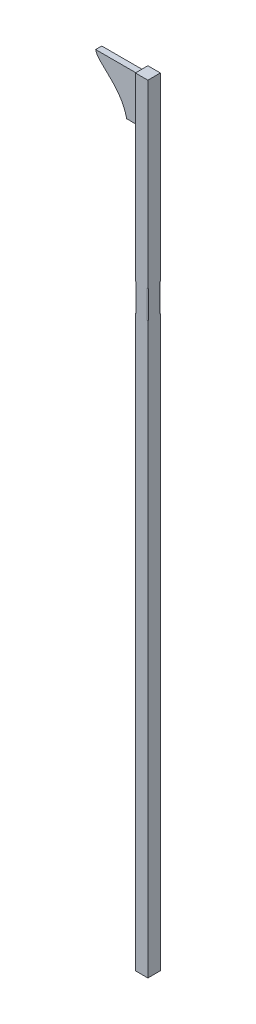
ISO-10303-21;
HEADER;
FILE_DESCRIPTION(('STEP AP214'),'2;1');
FILE_NAME('part.step','',(''),(''),'','','');
FILE_SCHEMA(('AUTOMOTIVE_DESIGN { 1 0 10303 214 1 1 1 1 }'));
ENDSEC;
DATA;
#1=APPLICATION_CONTEXT('core data for automotive mechanical design processes');
#2=APPLICATION_PROTOCOL_DEFINITION('international standard','automotive_design',2000,#1);
#3=PRODUCT_CONTEXT('',#1,'mechanical');
#4=PRODUCT('Part','Part','',(#3));
#5=PRODUCT_RELATED_PRODUCT_CATEGORY('part','',(#4));
#6=PRODUCT_DEFINITION_FORMATION('','',#4);
#7=PRODUCT_DEFINITION_CONTEXT('part definition',#1,'design');
#8=PRODUCT_DEFINITION('design','',#6,#7);
#9=PRODUCT_DEFINITION_SHAPE('','',#8);
#10=(LENGTH_UNIT() NAMED_UNIT(*) SI_UNIT(.MILLI.,.METRE.));
#11=(NAMED_UNIT(*) PLANE_ANGLE_UNIT() SI_UNIT($,.RADIAN.));
#12=(NAMED_UNIT(*) SI_UNIT($,.STERADIAN.) SOLID_ANGLE_UNIT());
#13=UNCERTAINTY_MEASURE_WITH_UNIT(LENGTH_MEASURE(1.E-05),#10,'distance_accuracy_value','');
#14=(GEOMETRIC_REPRESENTATION_CONTEXT(3) GLOBAL_UNCERTAINTY_ASSIGNED_CONTEXT((#13)) GLOBAL_UNIT_ASSIGNED_CONTEXT((#10,
#11,#12)) REPRESENTATION_CONTEXT('',''));
#15=CARTESIAN_POINT('',(0.,0.,0.));
#16=DIRECTION('',(0.,0.,1.));
#17=DIRECTION('',(1.,0.,0.));
#18=AXIS2_PLACEMENT_3D('',#15,#16,#17);
#19=CARTESIAN_POINT('',(0.85,2.9,0.110173502610086));
#20=DIRECTION('',(0.,0.,1.));
#21=DIRECTION('',(1.,0.,0.));
#22=AXIS2_PLACEMENT_3D('',#19,#20,#21);
#23=PLANE('',#22);
#24=DIRECTION('',(0.,1.,0.));
#25=VECTOR('',#24,1.);
#26=CARTESIAN_POINT('',(0.85,2.9,0.110173502610086));
#27=LINE('',#26,#25);
#28=CARTESIAN_POINT('',(0.85,1.3,0.110173502610086));
#29=VERTEX_POINT('',#28);
#30=CARTESIAN_POINT('',(0.85,2.9,0.110173502610086));
#31=VERTEX_POINT('',#30);
#32=EDGE_CURVE('E241',#29,#31,#27,.T.);
#33=ORIENTED_EDGE('',*,*,#32,.T.);
#34=DIRECTION('',(1.,0.,0.));
#35=VECTOR('',#34,1.);
#36=CARTESIAN_POINT('',(0.85,2.9,0.110173502610086));
#37=LINE('',#36,#35);
#38=CARTESIAN_POINT('',(-0.695429372194855,2.9,0.110173502610086));
#39=VERTEX_POINT('',#38);
#40=EDGE_CURVE('E112',#31,#39,#37,.F.);
#41=ORIENTED_EDGE('',*,*,#40,.T.);
#42=CARTESIAN_POINT('',(-0.695429372194855,2.9,0.110173502610086));
#43=CARTESIAN_POINT('',(-0.693743010396967,2.89020941359016,0.110173502610086));
#44=CARTESIAN_POINT('',(-0.691443286062049,2.88055261613905,0.110173502610086));
#45=CARTESIAN_POINT('',(-0.685858469884509,2.86156319851085,0.110173502610086));
#46=CARTESIAN_POINT('',(-0.682577059484016,2.85222951004612,0.110173502610086));
#47=CARTESIAN_POINT('',(-0.671659505621603,2.82485725320819,0.110173502610086));
#48=CARTESIAN_POINT('',(-0.662910976582811,2.80726943969666,0.110173502610086));
#49=CARTESIAN_POINT('',(-0.6439681571841,2.77390892412903,0.110173502610086));
#50=CARTESIAN_POINT('',(-0.633849612469007,2.75809107626599,0.110173502610086));
#51=CARTESIAN_POINT('',(-0.612471710255078,2.72726653572626,0.110173502610086));
#52=CARTESIAN_POINT('',(-0.601212993609684,2.71225939457226,0.110173502610086));
#53=CARTESIAN_POINT('',(-0.583734455628072,2.69023298955676,0.110173502610086));
#54=CARTESIAN_POINT('',(-0.577811392100028,2.68297329495508,0.110173502610086));
#55=CARTESIAN_POINT('',(-0.559788641575943,2.66140176835493,0.110173502610086));
#56=CARTESIAN_POINT('',(-0.54743699205387,2.64729959745781,0.110173502610086));
#57=CARTESIAN_POINT('',(-0.522261676733863,2.61953095438562,0.110173502610086));
#58=CARTESIAN_POINT('',(-0.509438059727299,2.60586443744431,0.110173502610086));
#59=CARTESIAN_POINT('',(-0.483453692230627,2.57885845768262,0.110173502610086));
#60=CARTESIAN_POINT('',(-0.470292961328184,2.56551897594794,0.110173502610086));
#61=CARTESIAN_POINT('',(-0.443737348609213,2.53907719202553,0.110173502610086));
#62=CARTESIAN_POINT('',(-0.430342474522504,2.52597488203695,0.110173502610086));
#63=CARTESIAN_POINT('',(-0.38993087794896,2.48690355706978,0.110173502610086));
#64=CARTESIAN_POINT('',(-0.362687315106192,2.46117028277675,0.110173502610086));
#65=CARTESIAN_POINT('',(-0.321733195940544,2.42266845755311,0.110173502610086));
#66=CARTESIAN_POINT('',(-0.308067273625455,2.40985109313162,0.110173502610086));
#67=CARTESIAN_POINT('',(-0.28075066867141,2.38419978294292,0.110173502610086));
#68=CARTESIAN_POINT('',(-0.267099986039994,2.37136583716751,0.110173502610086));
#69=CARTESIAN_POINT('',(-0.239857654340333,2.34563560302649,0.110173502610086));
#70=CARTESIAN_POINT('',(-0.226266005463026,2.33273931445951,0.110173502610086));
#71=CARTESIAN_POINT('',(-0.185637928007136,2.29389243101258,0.110173502610086));
#72=CARTESIAN_POINT('',(-0.158749514946432,2.26778488126992,0.110173502610086));
#73=CARTESIAN_POINT('',(-0.11894487321419,2.22809538503721,0.110173502610086));
#74=CARTESIAN_POINT('',(-0.105764788914697,2.21477766452826,0.110173502610086));
#75=CARTESIAN_POINT('',(-0.066539549213783,2.17450676537068,0.110173502610086));
#76=CARTESIAN_POINT('',(-0.0408129107125575,2.14723922429029,0.110173502610086));
#77=CARTESIAN_POINT('',(-0.00309705002108546,2.10555067899688,0.110173502610086));
#78=CARTESIAN_POINT('',(0.00932864456145964,2.09152398460811,0.110173502610086));
#79=CARTESIAN_POINT('',(0.033851507948452,2.06318650579164,0.110173502610086));
#80=CARTESIAN_POINT('',(0.0459486725289555,2.04887571771542,0.110173502610086));
#81=CARTESIAN_POINT('',(0.0816991335272794,2.00547647270423,0.110173502610086));
#82=CARTESIAN_POINT('',(0.104804238961328,1.97592897647773,0.110173502610086));
#83=CARTESIAN_POINT('',(0.138140870484324,1.93065072473418,0.110173502610086));
#84=CARTESIAN_POINT('',(0.149031649688048,1.91540041035821,0.110173502610086));
#85=CARTESIAN_POINT('',(0.181012735542857,1.86914597057402,0.110173502610086));
#86=CARTESIAN_POINT('',(0.20140305620887,1.8376494701496,0.110173502610086));
#87=CARTESIAN_POINT('',(0.230412078802925,1.7894739741318,0.110173502610086));
#88=CARTESIAN_POINT('',(0.239817495727318,1.77326328128982,0.110173502610086));
#89=CARTESIAN_POINT('',(0.258086310316687,1.74053930654597,0.110173502610086));
#90=CARTESIAN_POINT('',(0.266949705249493,1.72402602311937,0.110173502610086));
#91=CARTESIAN_POINT('',(0.292708708413838,1.67403265228314,0.110173502610086));
#92=CARTESIAN_POINT('',(0.308764765338648,1.64011291064353,0.110173502610086));
#93=CARTESIAN_POINT('',(0.331089752645885,1.58849462478003,0.110173502610086));
#94=CARTESIAN_POINT('',(0.338236892465258,1.57116919872642,0.110173502610086));
#95=CARTESIAN_POINT('',(0.351944467962792,1.53628726926922,0.110173502610086));
#96=CARTESIAN_POINT('',(0.358504904718552,1.51873076629014,0.110173502610086));
#97=CARTESIAN_POINT('',(0.376413517801572,1.46824986377578,0.110173502610086));
#98=CARTESIAN_POINT('',(0.387038900833349,1.43506682141457,0.110173502610086));
#99=CARTESIAN_POINT('',(0.406306850163346,1.36799652628218,0.110173502610086));
#100=CARTESIAN_POINT('',(0.41494194229057,1.33410712392479,0.110173502610086));
#101=CARTESIAN_POINT('',(0.422568765411088,1.3,0.110173502610086));
#102=B_SPLINE_CURVE_WITH_KNOTS('',3,(#42,#43,#44,#45,#46,#47,#48,#49,#50,#51,#52,#53,#54,#55,
#56,#57,#58,#59,#60,#61,#62,#63,#64,#65,#66,#67,#68,#69,#70,#71,#72,#73,#74,#75,#76,#77,#78,#79,
#80,#81,#82,#83,#84,#85,#86,#87,#88,#89,#90,#91,#92,#93,#94,#95,#96,#97,#98,#99,#100,#101),
.UNSPECIFIED.,.F.,.F.,(4,2,2,2,2,2,2,2,2,2,2,2,2,2,2,2,2,2,2,2,2,2,2,2,2,2,2,2,2,4),(0.,
0.0297436220414956,0.0593770710499198,0.118105170148429,0.174377705293055,0.230618785202047,
0.258725530106993,0.314946936817664,0.371162547670008,0.427374899546846,0.483585399164937,
0.596006970226482,0.652215734151485,0.708424525874238,0.764633499263295,0.877056135730666,
0.933266293735685,1.04570119976743,1.10191325032018,1.1581260232552,1.2705833906442,
1.32679822701093,1.43927026239768,1.49548652826316,1.55170307747461,1.66418467139521,
1.72040144538854,1.7766181161261,1.88107838963386,1.98592477533249),.UNSPECIFIED.);
#103=CARTESIAN_POINT('',(0.422568765411088,1.3,0.110173502610086));
#104=VERTEX_POINT('',#103);
#105=EDGE_CURVE('E24',#39,#104,#102,.T.);
#106=ORIENTED_EDGE('',*,*,#105,.T.);
#107=DIRECTION('',(1.,0.,0.));
#108=VECTOR('',#107,1.);
#109=CARTESIAN_POINT('',(0.85,1.3,0.110173502610086));
#110=LINE('',#109,#108);
#111=EDGE_CURVE('E244',#104,#29,#110,.T.);
#112=ORIENTED_EDGE('',*,*,#111,.T.);
#113=EDGE_LOOP('',(#33,#41,#106,#112));
#114=FACE_BOUND('',#113,.T.);
#115=ADVANCED_FACE('F17',(#114),#23,.T.);
#116=CARTESIAN_POINT('',(-0.695429372194855,2.9,0.110173502610086));
#117=CARTESIAN_POINT('',(-0.695429372194855,2.9,-0.258517350261009));
#118=CARTESIAN_POINT('',(-0.693387265277208,2.88809636380361,0.110173502610086));
#119=CARTESIAN_POINT('',(-0.693387265277208,2.88809636380361,-0.258517350261009));
#120=CARTESIAN_POINT('',(-0.687600545375743,2.86371605209398,0.110173502610086));
#121=CARTESIAN_POINT('',(-0.687600545375743,2.86371605209398,-0.258517350261009));
#122=CARTESIAN_POINT('',(-0.673812765073498,2.82542645863569,0.110173502610086));
#123=CARTESIAN_POINT('',(-0.673812765073498,2.82542645863569,-0.258517350261009));
#124=CARTESIAN_POINT('',(-0.645140964065163,2.77091049315777,0.110173502610086));
#125=CARTESIAN_POINT('',(-0.645140964065163,2.77091049315777,-0.258517350261009));
#126=CARTESIAN_POINT('',(-0.59198445007733,2.69682923305623,0.110173502610086));
#127=CARTESIAN_POINT('',(-0.59198445007733,2.69682923305623,-0.258517350261009));
#128=CARTESIAN_POINT('',(-0.521823108463555,2.61658428599538,0.110173502610086));
#129=CARTESIAN_POINT('',(-0.521823108463555,2.61658428599538,-0.258517350261009));
#130=CARTESIAN_POINT('',(-0.435874126069901,2.52992903397786,0.110173502610086));
#131=CARTESIAN_POINT('',(-0.435874126069901,2.52992903397786,-0.258517350261009));
#132=CARTESIAN_POINT('',(-0.33697744399691,2.43667637262445,0.110173502610086));
#133=CARTESIAN_POINT('',(-0.33697744399691,2.43667637262445,-0.258517350261009));
#134=CARTESIAN_POINT('',(-0.229552972077057,2.33672192162866,0.110173502610086));
#135=CARTESIAN_POINT('',(-0.229552972077057,2.33672192162866,-0.258517350261009));
#136=CARTESIAN_POINT('',(-0.118750676248019,2.23000623278704,0.110173502610086));
#137=CARTESIAN_POINT('',(-0.118750676248019,2.23000623278704,-0.258517350261009));
#138=CARTESIAN_POINT('',(-0.00984904519551834,2.1165180277452,0.110173502610086));
#139=CARTESIAN_POINT('',(-0.00984904519551834,2.1165180277452,-0.258517350261009));
#140=CARTESIAN_POINT('',(0.0923766508681799,1.99630033573052,0.110173502610086));
#141=CARTESIAN_POINT('',(0.0923766508681799,1.99630033573052,-0.258517350261009));
#142=CARTESIAN_POINT('',(0.184391492529208,1.8694934666017,0.110173502610086));
#143=CARTESIAN_POINT('',(0.184391492529208,1.8694934666017,-0.258517350261009));
#144=CARTESIAN_POINT('',(0.26429618325359,1.73634817183317,0.110173502610086));
#145=CARTESIAN_POINT('',(0.26429618325359,1.73634817183317,-0.258517350261009));
#146=CARTESIAN_POINT('',(0.33122746908363,1.59713590790976,0.110173502610086));
#147=CARTESIAN_POINT('',(0.33122746908363,1.59713590790976,-0.258517350261009));
#148=CARTESIAN_POINT('',(0.374255321752616,1.48110565683171,0.110173502610086));
#149=CARTESIAN_POINT('',(0.374255321752616,1.48110565683171,-0.258517350261009));
#150=CARTESIAN_POINT('',(0.40067200183349,1.39153608835763,0.110173502610086));
#151=CARTESIAN_POINT('',(0.40067200183349,1.39153608835763,-0.258517350261009));
#152=CARTESIAN_POINT('',(0.415700322073785,1.33069931887451,0.110173502610086));
#153=CARTESIAN_POINT('',(0.415700322073785,1.33069931887451,-0.258517350261009));
#154=CARTESIAN_POINT('',(0.422568765411088,1.3,0.110173502610086));
#155=CARTESIAN_POINT('',(0.422568765411088,1.3,-0.258517350261009));
#156=B_SPLINE_SURFACE_WITH_KNOTS('',5,1,((#116,#117),(#118,#119),(#120,#121),(#122,#123),(#124,
#125),(#126,#127),(#128,#129),(#130,#131),(#132,#133),(#134,#135),(#136,#137),(#138,#139),(#140,
#141),(#142,#143),(#144,#145),(#146,#147),(#148,#149),(#150,#151),(#152,#153),(#154,#155)),
.UNSPECIFIED.,.F.,.F.,.F.,(6,1,1,1,1,1,1,1,1,1,1,1,1,1,1,6),(2,2),(0.,0.0666666666666667,
0.133333333333333,0.2,0.266666666666667,0.333333333333333,0.4,0.466666666666667,
0.533333333333333,0.6,0.666666666666667,0.733333333333333,0.8,0.866666666666667,
0.933333333333333,1.),(0.,0.0368690852871095),.UNSPECIFIED.);
#157=DIRECTION('',(0.,0.,-1.));
#158=VECTOR('',#157,1.);
#159=CARTESIAN_POINT('',(0.422568765411088,1.3,0.));
#160=LINE('',#159,#158);
#161=CARTESIAN_POINT('',(0.422568765411088,1.3,-0.110173502610086));
#162=VERTEX_POINT('',#161);
#163=EDGE_CURVE('E211',#104,#162,#160,.T.);
#164=DIRECTION('',(0.,0.,1.));
#165=VECTOR('',#164,1.);
#166=CARTESIAN_POINT('',(-0.695429372194855,2.9,0.));
#167=LINE('',#166,#165);
#168=CARTESIAN_POINT('',(-0.695429372194855,2.9,-0.110173502610086));
#169=VERTEX_POINT('',#168);
#170=EDGE_CURVE('E228',#169,#39,#167,.T.);
#171=CARTESIAN_POINT('',(0.422568765411088,1.3,-0.110173502610086));
#172=CARTESIAN_POINT('',(0.412154632224265,1.34662072203885,-0.110173502610086));
#173=CARTESIAN_POINT('',(0.399841752934884,1.39282962290545,-0.110173502610086));
#174=CARTESIAN_POINT('',(0.371405565912336,1.48405901261098,-0.110173502610086));
#175=CARTESIAN_POINT('',(0.355282177280435,1.52907947619632,-0.110173502610086));
#176=CARTESIAN_POINT('',(0.319466262267442,1.61694262679933,-0.110173502610086));
#177=CARTESIAN_POINT('',(0.299827153422635,1.65980704445106,-0.110173502610086));
#178=CARTESIAN_POINT('',(0.256994284469701,1.74370620538035,-0.110173502610086));
#179=CARTESIAN_POINT('',(0.233801373552192,1.78474138274381,-0.110173502610086));
#180=CARTESIAN_POINT('',(0.186755591604197,1.86063573520738,-0.110173502610086));
#181=CARTESIAN_POINT('',(0.163221407114944,1.8956937232152,-0.110173502610086));
#182=CARTESIAN_POINT('',(0.113872842840117,1.96416842562567,-0.110173502610086));
#183=CARTESIAN_POINT('',(0.0880580592860444,1.99758484776128,-0.110173502610086));
#184=CARTESIAN_POINT('',(0.0344809400541347,2.06294904788528,-0.110173502610086));
#185=CARTESIAN_POINT('',(0.00671380585450841,2.09489286342842,-0.110173502610086));
#186=CARTESIAN_POINT('',(-0.0502636269461311,2.15745366930699,-0.110173502610086));
#187=CARTESIAN_POINT('',(-0.0794738612511874,2.18807071864133,-0.110173502610086));
#188=CARTESIAN_POINT('',(-0.161719592694615,2.27141537018441,-0.110173502610086));
#189=CARTESIAN_POINT('',(-0.215828605492879,2.32307066701699,-0.110173502610086));
#190=CARTESIAN_POINT('',(-0.297506216631087,2.3999791666338,-0.110173502610086));
#191=CARTESIAN_POINT('',(-0.324819651438351,2.42552131656231,-0.110173502610086));
#192=CARTESIAN_POINT('',(-0.37924104305594,2.47682363607506,-0.110173502610086));
#193=CARTESIAN_POINT('',(-0.406349024821064,2.50258377835012,-0.110173502610086));
#194=CARTESIAN_POINT('',(-0.44814534248856,2.5434189014607,-0.110173502610086));
#195=CARTESIAN_POINT('',(-0.463080525136,2.55823996987489,-0.110173502610086));
#196=CARTESIAN_POINT('',(-0.49259405841964,2.58824028595205,-0.110173502610086));
#197=CARTESIAN_POINT('',(-0.507172349239848,2.60341959283067,-0.110173502610086));
#198=CARTESIAN_POINT('',(-0.535836331868208,2.63431448912963,-0.110173502610086));
#199=CARTESIAN_POINT('',(-0.549920626832662,2.65003138435749,-0.110173502610086));
#200=CARTESIAN_POINT('',(-0.57730384671812,2.6821313915072,-0.110173502610086));
#201=CARTESIAN_POINT('',(-0.590603108466261,2.69851421253577,-0.110173502610086));
#202=CARTESIAN_POINT('',(-0.618197740105102,2.73499876718826,-0.110173502610086));
#203=CARTESIAN_POINT('',(-0.632282744082727,2.75526167461861,-0.110173502610086));
#204=CARTESIAN_POINT('',(-0.657790542110257,2.79728789702035,-0.110173502610086));
#205=CARTESIAN_POINT('',(-0.669233177396491,2.81903832587496,-0.110173502610086));
#206=CARTESIAN_POINT('',(-0.682165127781988,2.85109905650452,-0.110173502610086));
#207=CARTESIAN_POINT('',(-0.685553899516295,2.86062871176227,-0.110173502610086));
#208=CARTESIAN_POINT('',(-0.691325086403159,2.88005677827577,-0.110173502610086));
#209=CARTESIAN_POINT('',(-0.693700257321053,2.88995731138347,-0.110173502610086));
#210=CARTESIAN_POINT('',(-0.695429372194855,2.9,-0.110173502610086));
#211=B_SPLINE_CURVE_WITH_KNOTS('',3,(#171,#172,#173,#174,#175,#176,#177,#178,#179,#180,#181,
#182,#183,#184,#185,#186,#187,#188,#189,#190,#191,#192,#193,#194,#195,#196,#197,#198,#199,#200,
#201,#202,#203,#204,#205,#206,#207,#208,#209,#210),.UNSPECIFIED.,.F.,.F.,(4,2,2,2,2,2,2,2,2,2,2,
2,2,2,2,2,2,2,2,4),(0.,0.143288606457201,0.286580255265811,0.427855509072659,0.569097057268753,
0.695670199914399,0.822265796774349,0.949184221086102,1.07609699575846,1.30045096140533,
1.41264326560923,1.52482171696632,1.58794085447353,1.65107049947255,1.71436622774738,
1.77763459788071,1.8515748284723,1.92494035530808,1.955232628086,1.98573791508355),.UNSPECIFIED.);
#212=EDGE_CURVE('E214',#162,#169,#211,.T.);
#213=ORIENTED_EDGE('',*,*,#163,.F.);
#214=ORIENTED_EDGE('',*,*,#105,.F.);
#215=ORIENTED_EDGE('',*,*,#170,.F.);
#216=ORIENTED_EDGE('',*,*,#212,.F.);
#217=EDGE_LOOP('',(#213,#214,#215,#216));
#218=FACE_BOUND('',#217,.T.);
#219=ADVANCED_FACE('F19',(#218),#156,.F.);
#220=CARTESIAN_POINT('',(0.,2.9,0.));
#221=DIRECTION('',(0.,1.,0.));
#222=DIRECTION('',(0.,0.,1.));
#223=AXIS2_PLACEMENT_3D('',#220,#221,#222);
#224=PLANE('',#223);
#225=DIRECTION('',(0.,0.,1.));
#226=VECTOR('',#225,1.);
#227=CARTESIAN_POINT('',(0.85,2.9,0.));
#228=LINE('',#227,#226);
#229=CARTESIAN_POINT('',(0.85,2.9,-0.110173502610086));
#230=VERTEX_POINT('',#229);
#231=EDGE_CURVE('E230',#31,#230,#228,.F.);
#232=ORIENTED_EDGE('',*,*,#231,.T.);
#233=DIRECTION('',(-1.,0.,0.));
#234=VECTOR('',#233,1.);
#235=CARTESIAN_POINT('',(-0.85,2.9,-0.110173502610086));
#236=LINE('',#235,#234);
#237=EDGE_CURVE('E268',#169,#230,#236,.F.);
#238=ORIENTED_EDGE('',*,*,#237,.F.);
#239=ORIENTED_EDGE('',*,*,#170,.T.);
#240=ORIENTED_EDGE('',*,*,#40,.F.);
#241=EDGE_LOOP('',(#232,#238,#239,#240));
#242=FACE_BOUND('',#241,.T.);
#243=ADVANCED_FACE('F306',(#242),#224,.T.);
#244=CARTESIAN_POINT('',(0.,-3.5,0.));
#245=DIRECTION('',(0.,-1.,0.));
#246=DIRECTION('',(0.,0.,-1.));
#247=AXIS2_PLACEMENT_3D('',#244,#245,#246);
#248=PLANE('',#247);
#249=DIRECTION('',(0.,0.,-1.));
#250=VECTOR('',#249,1.);
#251=CARTESIAN_POINT('',(1.3,-3.5,0.225));
#252=LINE('',#251,#250);
#253=CARTESIAN_POINT('',(1.3,-3.5,0.225));
#254=VERTEX_POINT('',#253);
#255=CARTESIAN_POINT('',(1.3,-3.5,0.2));
#256=VERTEX_POINT('',#255);
#257=EDGE_CURVE('E189',#254,#256,#252,.T.);
#258=ORIENTED_EDGE('',*,*,#257,.F.);
#259=DIRECTION('',(1.,0.,0.));
#260=VECTOR('',#259,1.);
#261=CARTESIAN_POINT('',(0.85,-3.5,0.225));
#262=LINE('',#261,#260);
#263=CARTESIAN_POINT('',(1.275,-3.5,0.225));
#264=VERTEX_POINT('',#263);
#265=EDGE_CURVE('E174',#264,#254,#262,.T.);
#266=ORIENTED_EDGE('',*,*,#265,.F.);
#267=CARTESIAN_POINT('',(1.275,-3.5,0.2));
#268=DIRECTION('',(0.,1.,0.));
#269=DIRECTION('',(0.,0.,1.));
#270=AXIS2_PLACEMENT_3D('',#267,#268,#269);
#271=CIRCLE('',#270,0.025);
#272=EDGE_CURVE('E191',#256,#264,#271,.F.);
#273=ORIENTED_EDGE('',*,*,#272,.F.);
#274=EDGE_LOOP('',(#258,#266,#273));
#275=FACE_BOUND('',#274,.T.);
#276=ADVANCED_FACE('F190',(#275),#248,.T.);
#277=CARTESIAN_POINT('',(1.275,0.,0.2));
#278=DIRECTION('',(0.,1.,0.));
#279=DIRECTION('',(0.,0.,1.));
#280=AXIS2_PLACEMENT_3D('',#277,#278,#279);
#281=CYLINDRICAL_SURFACE('',#280,0.025);
#282=CARTESIAN_POINT('',(1.275,-4.5,0.2));
#283=DIRECTION('',(0.,1.,0.));
#284=DIRECTION('',(0.,0.,1.));
#285=AXIS2_PLACEMENT_3D('',#282,#283,#284);
#286=CIRCLE('',#285,0.025);
#287=CARTESIAN_POINT('',(1.275,-4.5,0.225));
#288=VERTEX_POINT('',#287);
#289=CARTESIAN_POINT('',(1.3,-4.5,0.2));
#290=VERTEX_POINT('',#289);
#291=EDGE_CURVE('E186',#288,#290,#286,.T.);
#292=ORIENTED_EDGE('',*,*,#291,.T.);
#293=DIRECTION('',(0.,1.,0.));
#294=VECTOR('',#293,1.);
#295=CARTESIAN_POINT('',(1.3,0.,0.2));
#296=LINE('',#295,#294);
#297=EDGE_CURVE('E195',#256,#290,#296,.F.);
#298=ORIENTED_EDGE('',*,*,#297,.F.);
#299=ORIENTED_EDGE('',*,*,#272,.T.);
#300=DIRECTION('',(0.,1.,0.));
#301=VECTOR('',#300,1.);
#302=CARTESIAN_POINT('',(1.275,0.,0.225));
#303=LINE('',#302,#301);
#304=EDGE_CURVE('E182',#288,#264,#303,.T.);
#305=ORIENTED_EDGE('',*,*,#304,.F.);
#306=EDGE_LOOP('',(#292,#298,#299,#305));
#307=FACE_BOUND('',#306,.T.);
#308=ADVANCED_FACE('F299',(#307),#281,.T.);
#309=CARTESIAN_POINT('',(0.,-4.5,0.));
#310=DIRECTION('',(0.,-1.,0.));
#311=DIRECTION('',(0.,0.,-1.));
#312=AXIS2_PLACEMENT_3D('',#309,#310,#311);
#313=PLANE('',#312);
#314=DIRECTION('',(1.,0.,0.));
#315=VECTOR('',#314,1.);
#316=CARTESIAN_POINT('',(0.85,-4.5,0.225));
#317=LINE('',#316,#315);
#318=CARTESIAN_POINT('',(1.3,-4.5,0.225));
#319=VERTEX_POINT('',#318);
#320=EDGE_CURVE('E239',#319,#288,#317,.F.);
#321=ORIENTED_EDGE('',*,*,#320,.F.);
#322=DIRECTION('',(0.,0.,-1.));
#323=VECTOR('',#322,1.);
#324=CARTESIAN_POINT('',(1.3,-4.5,0.225));
#325=LINE('',#324,#323);
#326=EDGE_CURVE('E442',#290,#319,#325,.F.);
#327=ORIENTED_EDGE('',*,*,#326,.F.);
#328=ORIENTED_EDGE('',*,*,#291,.F.);
#329=EDGE_LOOP('',(#321,#327,#328));
#330=FACE_BOUND('',#329,.T.);
#331=ADVANCED_FACE('F295',(#330),#313,.F.);
#332=CARTESIAN_POINT('',(0.,-3.5,0.));
#333=DIRECTION('',(0.,-1.,0.));
#334=DIRECTION('',(0.,0.,-1.));
#335=AXIS2_PLACEMENT_3D('',#332,#333,#334);
#336=PLANE('',#335);
#337=DIRECTION('',(1.,0.,0.));
#338=VECTOR('',#337,1.);
#339=CARTESIAN_POINT('',(0.85,-3.5,0.225));
#340=LINE('',#339,#338);
#341=CARTESIAN_POINT('',(0.85,-3.5,0.225));
#342=VERTEX_POINT('',#341);
#343=CARTESIAN_POINT('',(0.875,-3.5,0.225));
#344=VERTEX_POINT('',#343);
#345=EDGE_CURVE('E185',#342,#344,#340,.T.);
#346=ORIENTED_EDGE('',*,*,#345,.F.);
#347=DIRECTION('',(0.,0.,1.));
#348=VECTOR('',#347,1.);
#349=CARTESIAN_POINT('',(0.85,-3.5,-0.225));
#350=LINE('',#349,#348);
#351=CARTESIAN_POINT('',(0.85,-3.5,0.2));
#352=VERTEX_POINT('',#351);
#353=EDGE_CURVE('E420',#352,#342,#350,.T.);
#354=ORIENTED_EDGE('',*,*,#353,.F.);
#355=CARTESIAN_POINT('',(0.875,-3.5,0.2));
#356=DIRECTION('',(0.,1.,0.));
#357=DIRECTION('',(0.,0.,1.));
#358=AXIS2_PLACEMENT_3D('',#355,#356,#357);
#359=CIRCLE('',#358,0.025);
#360=EDGE_CURVE('E403',#344,#352,#359,.F.);
#361=ORIENTED_EDGE('',*,*,#360,.F.);
#362=EDGE_LOOP('',(#346,#354,#361));
#363=FACE_BOUND('',#362,.T.);
#364=ADVANCED_FACE('F292',(#363),#336,.T.);
#365=CARTESIAN_POINT('',(0.85,0.,0.225));
#366=DIRECTION('',(0.,0.,1.));
#367=DIRECTION('',(1.,0.,0.));
#368=AXIS2_PLACEMENT_3D('',#365,#366,#367);
#369=PLANE('',#368);
#370=ORIENTED_EDGE('',*,*,#320,.T.);
#371=ORIENTED_EDGE('',*,*,#304,.T.);
#372=ORIENTED_EDGE('',*,*,#265,.T.);
#373=DIRECTION('',(0.,1.,0.));
#374=VECTOR('',#373,1.);
#375=CARTESIAN_POINT('',(1.3,0.,0.225));
#376=LINE('',#375,#374);
#377=CARTESIAN_POINT('',(1.3,3.,0.225));
#378=VERTEX_POINT('',#377);
#379=EDGE_CURVE('E179',#378,#254,#376,.F.);
#380=ORIENTED_EDGE('',*,*,#379,.F.);
#381=DIRECTION('',(1.,0.,0.));
#382=VECTOR('',#381,1.);
#383=CARTESIAN_POINT('',(1.075,3.,0.225));
#384=LINE('',#383,#382);
#385=CARTESIAN_POINT('',(0.85,3.,0.225));
#386=VERTEX_POINT('',#385);
#387=EDGE_CURVE('E261',#386,#378,#384,.T.);
#388=ORIENTED_EDGE('',*,*,#387,.F.);
#389=DIRECTION('',(0.,1.,0.));
#390=VECTOR('',#389,1.);
#391=CARTESIAN_POINT('',(0.85,0.,0.225));
#392=LINE('',#391,#390);
#393=EDGE_CURVE('E381',#342,#386,#392,.T.);
#394=ORIENTED_EDGE('',*,*,#393,.F.);
#395=ORIENTED_EDGE('',*,*,#345,.T.);
#396=DIRECTION('',(0.,1.,0.));
#397=VECTOR('',#396,1.);
#398=CARTESIAN_POINT('',(0.875,0.,0.225));
#399=LINE('',#398,#397);
#400=CARTESIAN_POINT('',(0.875,-4.5,0.225));
#401=VERTEX_POINT('',#400);
#402=EDGE_CURVE('E215',#401,#344,#399,.T.);
#403=ORIENTED_EDGE('',*,*,#402,.F.);
#404=DIRECTION('',(1.,0.,0.));
#405=VECTOR('',#404,1.);
#406=CARTESIAN_POINT('',(0.,-4.5,0.225));
#407=LINE('',#406,#405);
#408=CARTESIAN_POINT('',(0.85,-4.5,0.225));
#409=VERTEX_POINT('',#408);
#410=EDGE_CURVE('E238',#401,#409,#407,.F.);
#411=ORIENTED_EDGE('',*,*,#410,.T.);
#412=DIRECTION('',(0.,1.,0.));
#413=VECTOR('',#412,1.);
#414=CARTESIAN_POINT('',(0.85,0.,0.225));
#415=LINE('',#414,#413);
#416=CARTESIAN_POINT('',(0.85,-25.,0.225));
#417=VERTEX_POINT('',#416);
#418=EDGE_CURVE('E411',#417,#409,#415,.T.);
#419=ORIENTED_EDGE('',*,*,#418,.F.);
#420=DIRECTION('',(1.,0.,0.));
#421=VECTOR('',#420,1.);
#422=CARTESIAN_POINT('',(1.075,-25.,0.225));
#423=LINE('',#422,#421);
#424=CARTESIAN_POINT('',(1.3,-25.,0.225));
#425=VERTEX_POINT('',#424);
#426=EDGE_CURVE('E418',#425,#417,#423,.F.);
#427=ORIENTED_EDGE('',*,*,#426,.F.);
#428=DIRECTION('',(0.,1.,0.));
#429=VECTOR('',#428,1.);
#430=CARTESIAN_POINT('',(1.3,0.,0.225));
#431=LINE('',#430,#429);
#432=EDGE_CURVE('E439',#319,#425,#431,.F.);
#433=ORIENTED_EDGE('',*,*,#432,.F.);
#434=EDGE_LOOP('',(#370,#371,#372,#380,#388,#394,#395,#403,#411,#419,#427,#433));
#435=FACE_BOUND('',#434,.T.);
#436=ADVANCED_FACE('F177',(#435),#369,.T.);
#437=CARTESIAN_POINT('',(0.,-4.5,0.));
#438=DIRECTION('',(0.,-1.,0.));
#439=DIRECTION('',(0.,0.,-1.));
#440=AXIS2_PLACEMENT_3D('',#437,#438,#439);
#441=PLANE('',#440);
#442=DIRECTION('',(0.,0.,1.));
#443=VECTOR('',#442,1.);
#444=CARTESIAN_POINT('',(0.85,-4.5,-0.225));
#445=LINE('',#444,#443);
#446=CARTESIAN_POINT('',(0.85,-4.5,0.2));
#447=VERTEX_POINT('',#446);
#448=EDGE_CURVE('E408',#409,#447,#445,.F.);
#449=ORIENTED_EDGE('',*,*,#448,.F.);
#450=ORIENTED_EDGE('',*,*,#410,.F.);
#451=CARTESIAN_POINT('',(0.875,-4.5,0.2));
#452=DIRECTION('',(0.,1.,0.));
#453=DIRECTION('',(0.,0.,1.));
#454=AXIS2_PLACEMENT_3D('',#451,#452,#453);
#455=CIRCLE('',#454,0.025);
#456=EDGE_CURVE('E236',#447,#401,#455,.T.);
#457=ORIENTED_EDGE('',*,*,#456,.F.);
#458=EDGE_LOOP('',(#449,#450,#457));
#459=FACE_BOUND('',#458,.T.);
#460=ADVANCED_FACE('F285',(#459),#441,.F.);
#461=CARTESIAN_POINT('',(0.875,0.,0.2));
#462=DIRECTION('',(0.,1.,0.));
#463=DIRECTION('',(0.,0.,1.));
#464=AXIS2_PLACEMENT_3D('',#461,#462,#463);
#465=CYLINDRICAL_SURFACE('',#464,0.025);
#466=ORIENTED_EDGE('',*,*,#456,.T.);
#467=ORIENTED_EDGE('',*,*,#402,.T.);
#468=ORIENTED_EDGE('',*,*,#360,.T.);
#469=DIRECTION('',(0.,1.,0.));
#470=VECTOR('',#469,1.);
#471=CARTESIAN_POINT('',(0.85,0.,0.2));
#472=LINE('',#471,#470);
#473=EDGE_CURVE('E225',#447,#352,#472,.T.);
#474=ORIENTED_EDGE('',*,*,#473,.F.);
#475=EDGE_LOOP('',(#466,#467,#468,#474));
#476=FACE_BOUND('',#475,.T.);
#477=ADVANCED_FACE('F281',(#476),#465,.T.);
#478=CARTESIAN_POINT('',(0.,1.3,0.));
#479=DIRECTION('',(0.,-1.,0.));
#480=DIRECTION('',(0.,0.,-1.));
#481=AXIS2_PLACEMENT_3D('',#478,#479,#480);
#482=PLANE('',#481);
#483=DIRECTION('',(0.,0.,1.));
#484=VECTOR('',#483,1.);
#485=CARTESIAN_POINT('',(0.85,1.3,-0.225));
#486=LINE('',#485,#484);
#487=CARTESIAN_POINT('',(0.85,1.3,-0.110173502610086));
#488=VERTEX_POINT('',#487);
#489=EDGE_CURVE('E220',#29,#488,#486,.F.);
#490=ORIENTED_EDGE('',*,*,#489,.F.);
#491=ORIENTED_EDGE('',*,*,#111,.F.);
#492=ORIENTED_EDGE('',*,*,#163,.T.);
#493=DIRECTION('',(-1.,0.,0.));
#494=VECTOR('',#493,1.);
#495=CARTESIAN_POINT('',(-0.85,1.3,-0.110173502610086));
#496=LINE('',#495,#494);
#497=EDGE_CURVE('E393',#488,#162,#496,.T.);
#498=ORIENTED_EDGE('',*,*,#497,.F.);
#499=EDGE_LOOP('',(#490,#491,#492,#498));
#500=FACE_BOUND('',#499,.T.);
#501=ADVANCED_FACE('F276',(#500),#482,.T.);
#502=CARTESIAN_POINT('',(-0.85,2.9,-0.110173502610086));
#503=DIRECTION('',(0.,0.,-1.));
#504=DIRECTION('',(-1.,0.,0.));
#505=AXIS2_PLACEMENT_3D('',#502,#503,#504);
#506=PLANE('',#505);
#507=DIRECTION('',(0.,1.,0.));
#508=VECTOR('',#507,1.);
#509=CARTESIAN_POINT('',(0.85,0.,-0.110173502610086));
#510=LINE('',#509,#508);
#511=EDGE_CURVE('E216',#488,#230,#510,.T.);
#512=ORIENTED_EDGE('',*,*,#511,.F.);
#513=ORIENTED_EDGE('',*,*,#497,.T.);
#514=ORIENTED_EDGE('',*,*,#212,.T.);
#515=ORIENTED_EDGE('',*,*,#237,.T.);
#516=EDGE_LOOP('',(#512,#513,#514,#515));
#517=FACE_BOUND('',#516,.T.);
#518=ADVANCED_FACE('F270',(#517),#506,.T.);
#519=CARTESIAN_POINT('',(0.,-3.5,0.));
#520=DIRECTION('',(0.,-1.,0.));
#521=DIRECTION('',(0.,0.,-1.));
#522=AXIS2_PLACEMENT_3D('',#519,#520,#521);
#523=PLANE('',#522);
#524=DIRECTION('',(0.,0.,1.));
#525=VECTOR('',#524,1.);
#526=CARTESIAN_POINT('',(0.85,-3.5,-0.225));
#527=LINE('',#526,#525);
#528=CARTESIAN_POINT('',(0.85,-3.5,-0.225));
#529=VERTEX_POINT('',#528);
#530=CARTESIAN_POINT('',(0.85,-3.5,-0.2));
#531=VERTEX_POINT('',#530);
#532=EDGE_CURVE('E129',#529,#531,#527,.T.);
#533=ORIENTED_EDGE('',*,*,#532,.F.);
#534=DIRECTION('',(-1.,0.,0.));
#535=VECTOR('',#534,1.);
#536=CARTESIAN_POINT('',(1.3,-3.5,-0.225));
#537=LINE('',#536,#535);
#538=CARTESIAN_POINT('',(0.875,-3.5,-0.225));
#539=VERTEX_POINT('',#538);
#540=EDGE_CURVE('E135',#539,#529,#537,.T.);
#541=ORIENTED_EDGE('',*,*,#540,.F.);
#542=CARTESIAN_POINT('',(0.875,-3.5,-0.2));
#543=DIRECTION('',(0.,-1.,0.));
#544=DIRECTION('',(0.,0.,-1.));
#545=AXIS2_PLACEMENT_3D('',#542,#543,#544);
#546=CIRCLE('',#545,0.025);
#547=EDGE_CURVE('E252',#531,#539,#546,.T.);
#548=ORIENTED_EDGE('',*,*,#547,.F.);
#549=EDGE_LOOP('',(#533,#541,#548));
#550=FACE_BOUND('',#549,.T.);
#551=ADVANCED_FACE('F275',(#550),#523,.T.);
#552=CARTESIAN_POINT('',(1.075,3.,0.));
#553=DIRECTION('',(0.,1.,0.));
#554=DIRECTION('',(0.,0.,1.));
#555=AXIS2_PLACEMENT_3D('',#552,#553,#554);
#556=PLANE('',#555);
#557=DIRECTION('',(0.,0.,-1.));
#558=VECTOR('',#557,1.);
#559=CARTESIAN_POINT('',(1.3,3.,0.225));
#560=LINE('',#559,#558);
#561=CARTESIAN_POINT('',(1.3,3.,-0.225));
#562=VERTEX_POINT('',#561);
#563=EDGE_CURVE('E200',#562,#378,#560,.F.);
#564=ORIENTED_EDGE('',*,*,#563,.F.);
#565=DIRECTION('',(-1.,0.,0.));
#566=VECTOR('',#565,1.);
#567=CARTESIAN_POINT('',(1.3,3.,-0.225));
#568=LINE('',#567,#566);
#569=CARTESIAN_POINT('',(0.85,3.,-0.225));
#570=VERTEX_POINT('',#569);
#571=EDGE_CURVE('E360',#570,#562,#568,.F.);
#572=ORIENTED_EDGE('',*,*,#571,.F.);
#573=DIRECTION('',(0.,0.,1.));
#574=VECTOR('',#573,1.);
#575=CARTESIAN_POINT('',(0.85,3.,-0.225));
#576=LINE('',#575,#574);
#577=EDGE_CURVE('E379',#386,#570,#576,.F.);
#578=ORIENTED_EDGE('',*,*,#577,.F.);
#579=ORIENTED_EDGE('',*,*,#387,.T.);
#580=EDGE_LOOP('',(#564,#572,#578,#579));
#581=FACE_BOUND('',#580,.T.);
#582=ADVANCED_FACE('F350',(#581),#556,.T.);
#583=CARTESIAN_POINT('',(0.,-3.5,0.));
#584=DIRECTION('',(0.,-1.,0.));
#585=DIRECTION('',(0.,0.,-1.));
#586=AXIS2_PLACEMENT_3D('',#583,#584,#585);
#587=PLANE('',#586);
#588=DIRECTION('',(-1.,0.,0.));
#589=VECTOR('',#588,1.);
#590=CARTESIAN_POINT('',(1.3,-3.5,-0.225));
#591=LINE('',#590,#589);
#592=CARTESIAN_POINT('',(1.3,-3.5,-0.225));
#593=VERTEX_POINT('',#592);
#594=CARTESIAN_POINT('',(1.275,-3.5,-0.225));
#595=VERTEX_POINT('',#594);
#596=EDGE_CURVE('E367',#593,#595,#591,.T.);
#597=ORIENTED_EDGE('',*,*,#596,.F.);
#598=DIRECTION('',(0.,0.,-1.));
#599=VECTOR('',#598,1.);
#600=CARTESIAN_POINT('',(1.3,-3.5,0.225));
#601=LINE('',#600,#599);
#602=CARTESIAN_POINT('',(1.3,-3.5,-0.2));
#603=VERTEX_POINT('',#602);
#604=EDGE_CURVE('E202',#603,#593,#601,.T.);
#605=ORIENTED_EDGE('',*,*,#604,.F.);
#606=CARTESIAN_POINT('',(1.275,-3.5,-0.2));
#607=DIRECTION('',(0.,1.,0.));
#608=DIRECTION('',(0.,0.,1.));
#609=AXIS2_PLACEMENT_3D('',#606,#607,#608);
#610=CIRCLE('',#609,0.025);
#611=EDGE_CURVE('E258',#595,#603,#610,.F.);
#612=ORIENTED_EDGE('',*,*,#611,.F.);
#613=EDGE_LOOP('',(#597,#605,#612));
#614=FACE_BOUND('',#613,.T.);
#615=ADVANCED_FACE('F347',(#614),#587,.T.);
#616=CARTESIAN_POINT('',(1.275,0.,-0.2));
#617=DIRECTION('',(0.,1.,0.));
#618=DIRECTION('',(0.,0.,1.));
#619=AXIS2_PLACEMENT_3D('',#616,#617,#618);
#620=CYLINDRICAL_SURFACE('',#619,0.025);
#621=CARTESIAN_POINT('',(1.275,-4.5,-0.2));
#622=DIRECTION('',(0.,1.,0.));
#623=DIRECTION('',(0.,0.,1.));
#624=AXIS2_PLACEMENT_3D('',#621,#622,#623);
#625=CIRCLE('',#624,0.025);
#626=CARTESIAN_POINT('',(1.3,-4.5,-0.2));
#627=VERTEX_POINT('',#626);
#628=CARTESIAN_POINT('',(1.275,-4.5,-0.225));
#629=VERTEX_POINT('',#628);
#630=EDGE_CURVE('E256',#627,#629,#625,.T.);
#631=ORIENTED_EDGE('',*,*,#630,.T.);
#632=DIRECTION('',(0.,1.,0.));
#633=VECTOR('',#632,1.);
#634=CARTESIAN_POINT('',(1.275,0.,-0.225));
#635=LINE('',#634,#633);
#636=EDGE_CURVE('E478',#595,#629,#635,.F.);
#637=ORIENTED_EDGE('',*,*,#636,.F.);
#638=ORIENTED_EDGE('',*,*,#611,.T.);
#639=DIRECTION('',(0.,1.,0.));
#640=VECTOR('',#639,1.);
#641=CARTESIAN_POINT('',(1.3,0.,-0.2));
#642=LINE('',#641,#640);
#643=EDGE_CURVE('E445',#627,#603,#642,.T.);
#644=ORIENTED_EDGE('',*,*,#643,.F.);
#645=EDGE_LOOP('',(#631,#637,#638,#644));
#646=FACE_BOUND('',#645,.T.);
#647=ADVANCED_FACE('F343',(#646),#620,.T.);
#648=CARTESIAN_POINT('',(0.,-4.5,0.));
#649=DIRECTION('',(0.,-1.,0.));
#650=DIRECTION('',(0.,0.,-1.));
#651=AXIS2_PLACEMENT_3D('',#648,#649,#650);
#652=PLANE('',#651);
#653=DIRECTION('',(0.,0.,-1.));
#654=VECTOR('',#653,1.);
#655=CARTESIAN_POINT('',(1.3,-4.5,0.225));
#656=LINE('',#655,#654);
#657=CARTESIAN_POINT('',(1.3,-4.5,-0.225));
#658=VERTEX_POINT('',#657);
#659=EDGE_CURVE('E441',#658,#627,#656,.F.);
#660=ORIENTED_EDGE('',*,*,#659,.F.);
#661=DIRECTION('',(-1.,0.,0.));
#662=VECTOR('',#661,1.);
#663=CARTESIAN_POINT('',(1.3,-4.5,-0.225));
#664=LINE('',#663,#662);
#665=EDGE_CURVE('E476',#629,#658,#664,.F.);
#666=ORIENTED_EDGE('',*,*,#665,.F.);
#667=ORIENTED_EDGE('',*,*,#630,.F.);
#668=EDGE_LOOP('',(#660,#666,#667));
#669=FACE_BOUND('',#668,.T.);
#670=ADVANCED_FACE('F340',(#669),#652,.F.);
#671=CARTESIAN_POINT('',(1.3,0.,0.225));
#672=DIRECTION('',(1.,0.,0.));
#673=DIRECTION('',(0.,0.,-1.));
#674=AXIS2_PLACEMENT_3D('',#671,#672,#673);
#675=PLANE('',#674);
#676=ORIENTED_EDGE('',*,*,#659,.T.);
#677=ORIENTED_EDGE('',*,*,#643,.T.);
#678=ORIENTED_EDGE('',*,*,#604,.T.);
#679=DIRECTION('',(0.,1.,0.));
#680=VECTOR('',#679,1.);
#681=CARTESIAN_POINT('',(1.3,0.,-0.225));
#682=LINE('',#681,#680);
#683=EDGE_CURVE('E363',#562,#593,#682,.F.);
#684=ORIENTED_EDGE('',*,*,#683,.F.);
#685=ORIENTED_EDGE('',*,*,#563,.T.);
#686=ORIENTED_EDGE('',*,*,#379,.T.);
#687=ORIENTED_EDGE('',*,*,#257,.T.);
#688=ORIENTED_EDGE('',*,*,#297,.T.);
#689=ORIENTED_EDGE('',*,*,#326,.T.);
#690=ORIENTED_EDGE('',*,*,#432,.T.);
#691=DIRECTION('',(0.,0.,-1.));
#692=VECTOR('',#691,1.);
#693=CARTESIAN_POINT('',(1.3,-25.,0.));
#694=LINE('',#693,#692);
#695=CARTESIAN_POINT('',(1.3,-25.,-0.225));
#696=VERTEX_POINT('',#695);
#697=EDGE_CURVE('E421',#696,#425,#694,.F.);
#698=ORIENTED_EDGE('',*,*,#697,.F.);
#699=DIRECTION('',(0.,1.,0.));
#700=VECTOR('',#699,1.);
#701=CARTESIAN_POINT('',(1.3,0.,-0.225));
#702=LINE('',#701,#700);
#703=EDGE_CURVE('E463',#658,#696,#702,.F.);
#704=ORIENTED_EDGE('',*,*,#703,.F.);
#705=EDGE_LOOP('',(#676,#677,#678,#684,#685,#686,#687,#688,#689,#690,#698,#704));
#706=FACE_BOUND('',#705,.T.);
#707=ADVANCED_FACE('F198',(#706),#675,.T.);
#708=CARTESIAN_POINT('',(1.075,-25.,0.));
#709=DIRECTION('',(0.,-1.,0.));
#710=DIRECTION('',(0.,0.,-1.));
#711=AXIS2_PLACEMENT_3D('',#708,#709,#710);
#712=PLANE('',#711);
#713=ORIENTED_EDGE('',*,*,#697,.T.);
#714=ORIENTED_EDGE('',*,*,#426,.T.);
#715=DIRECTION('',(0.,0.,1.));
#716=VECTOR('',#715,1.);
#717=CARTESIAN_POINT('',(0.85,-25.,-0.225));
#718=LINE('',#717,#716);
#719=CARTESIAN_POINT('',(0.85,-25.,-0.225));
#720=VERTEX_POINT('',#719);
#721=EDGE_CURVE('E385',#720,#417,#718,.T.);
#722=ORIENTED_EDGE('',*,*,#721,.F.);
#723=DIRECTION('',(-1.,0.,0.));
#724=VECTOR('',#723,1.);
#725=CARTESIAN_POINT('',(1.3,-25.,-0.225));
#726=LINE('',#725,#724);
#727=EDGE_CURVE('E468',#696,#720,#726,.T.);
#728=ORIENTED_EDGE('',*,*,#727,.F.);
#729=EDGE_LOOP('',(#713,#714,#722,#728));
#730=FACE_BOUND('',#729,.T.);
#731=ADVANCED_FACE('F333',(#730),#712,.T.);
#732=CARTESIAN_POINT('',(0.85,0.,-0.225));
#733=DIRECTION('',(-1.,0.,0.));
#734=DIRECTION('',(0.,0.,1.));
#735=AXIS2_PLACEMENT_3D('',#732,#733,#734);
#736=PLANE('',#735);
#737=ORIENTED_EDGE('',*,*,#511,.T.);
#738=ORIENTED_EDGE('',*,*,#231,.F.);
#739=ORIENTED_EDGE('',*,*,#32,.F.);
#740=ORIENTED_EDGE('',*,*,#489,.T.);
#741=EDGE_LOOP('',(#737,#738,#739,#740));
#742=FACE_BOUND('',#741,.T.);
#743=ORIENTED_EDGE('',*,*,#448,.T.);
#744=ORIENTED_EDGE('',*,*,#473,.T.);
#745=ORIENTED_EDGE('',*,*,#353,.T.);
#746=ORIENTED_EDGE('',*,*,#393,.T.);
#747=ORIENTED_EDGE('',*,*,#577,.T.);
#748=DIRECTION('',(0.,1.,0.));
#749=VECTOR('',#748,1.);
#750=CARTESIAN_POINT('',(0.85,0.,-0.225));
#751=LINE('',#750,#749);
#752=EDGE_CURVE('E369',#529,#570,#751,.T.);
#753=ORIENTED_EDGE('',*,*,#752,.F.);
#754=ORIENTED_EDGE('',*,*,#532,.T.);
#755=DIRECTION('',(0.,-1.,0.));
#756=VECTOR('',#755,1.);
#757=CARTESIAN_POINT('',(0.85,0.,-0.2));
#758=LINE('',#757,#756);
#759=CARTESIAN_POINT('',(0.85,-4.5,-0.2));
#760=VERTEX_POINT('',#759);
#761=EDGE_CURVE('E254',#760,#531,#758,.F.);
#762=ORIENTED_EDGE('',*,*,#761,.F.);
#763=DIRECTION('',(0.,0.,-1.));
#764=VECTOR('',#763,1.);
#765=CARTESIAN_POINT('',(0.85,-4.5,0.));
#766=LINE('',#765,#764);
#767=CARTESIAN_POINT('',(0.85,-4.5,-0.225));
#768=VERTEX_POINT('',#767);
#769=EDGE_CURVE('E219',#760,#768,#766,.T.);
#770=ORIENTED_EDGE('',*,*,#769,.T.);
#771=DIRECTION('',(0.,1.,0.));
#772=VECTOR('',#771,1.);
#773=CARTESIAN_POINT('',(0.85,0.,-0.225));
#774=LINE('',#773,#772);
#775=EDGE_CURVE('E472',#720,#768,#774,.T.);
#776=ORIENTED_EDGE('',*,*,#775,.F.);
#777=ORIENTED_EDGE('',*,*,#721,.T.);
#778=ORIENTED_EDGE('',*,*,#418,.T.);
#779=EDGE_LOOP('',(#743,#744,#745,#746,#747,#753,#754,#762,#770,#776,#777,#778));
#780=FACE_BOUND('',#779,.T.);
#781=ADVANCED_FACE('F330',(#742,#780),#736,.T.);
#782=CARTESIAN_POINT('',(0.,-4.5,0.));
#783=DIRECTION('',(0.,-1.,0.));
#784=DIRECTION('',(0.,0.,-1.));
#785=AXIS2_PLACEMENT_3D('',#782,#783,#784);
#786=PLANE('',#785);
#787=DIRECTION('',(-1.,0.,0.));
#788=VECTOR('',#787,1.);
#789=CARTESIAN_POINT('',(1.3,-4.5,-0.225));
#790=LINE('',#789,#788);
#791=CARTESIAN_POINT('',(0.875,-4.5,-0.225));
#792=VERTEX_POINT('',#791);
#793=EDGE_CURVE('E33',#768,#792,#790,.F.);
#794=ORIENTED_EDGE('',*,*,#793,.F.);
#795=ORIENTED_EDGE('',*,*,#769,.F.);
#796=CARTESIAN_POINT('',(0.875,-4.5,-0.2));
#797=DIRECTION('',(0.,-1.,0.));
#798=DIRECTION('',(0.,0.,-1.));
#799=AXIS2_PLACEMENT_3D('',#796,#797,#798);
#800=CIRCLE('',#799,0.025);
#801=EDGE_CURVE('E42',#792,#760,#800,.F.);
#802=ORIENTED_EDGE('',*,*,#801,.F.);
#803=EDGE_LOOP('',(#794,#795,#802));
#804=FACE_BOUND('',#803,.T.);
#805=ADVANCED_FACE('F323',(#804),#786,.F.);
#806=CARTESIAN_POINT('',(0.875,0.,-0.2));
#807=DIRECTION('',(0.,-1.,0.));
#808=DIRECTION('',(0.,0.,-1.));
#809=AXIS2_PLACEMENT_3D('',#806,#807,#808);
#810=CYLINDRICAL_SURFACE('',#809,0.025);
#811=ORIENTED_EDGE('',*,*,#547,.T.);
#812=DIRECTION('',(0.,1.,0.));
#813=VECTOR('',#812,1.);
#814=CARTESIAN_POINT('',(0.875,0.,-0.225));
#815=LINE('',#814,#813);
#816=EDGE_CURVE('E11',#792,#539,#815,.T.);
#817=ORIENTED_EDGE('',*,*,#816,.F.);
#818=ORIENTED_EDGE('',*,*,#801,.T.);
#819=ORIENTED_EDGE('',*,*,#761,.T.);
#820=EDGE_LOOP('',(#811,#817,#818,#819));
#821=FACE_BOUND('',#820,.T.);
#822=ADVANCED_FACE('F317',(#821),#810,.T.);
#823=CARTESIAN_POINT('',(1.3,0.,-0.225));
#824=DIRECTION('',(0.,0.,-1.));
#825=DIRECTION('',(-1.,0.,0.));
#826=AXIS2_PLACEMENT_3D('',#823,#824,#825);
#827=PLANE('',#826);
#828=ORIENTED_EDGE('',*,*,#793,.T.);
#829=ORIENTED_EDGE('',*,*,#816,.T.);
#830=ORIENTED_EDGE('',*,*,#540,.T.);
#831=ORIENTED_EDGE('',*,*,#752,.T.);
#832=ORIENTED_EDGE('',*,*,#571,.T.);
#833=ORIENTED_EDGE('',*,*,#683,.T.);
#834=ORIENTED_EDGE('',*,*,#596,.T.);
#835=ORIENTED_EDGE('',*,*,#636,.T.);
#836=ORIENTED_EDGE('',*,*,#665,.T.);
#837=ORIENTED_EDGE('',*,*,#703,.T.);
#838=ORIENTED_EDGE('',*,*,#727,.T.);
#839=ORIENTED_EDGE('',*,*,#775,.T.);
#840=EDGE_LOOP('',(#828,#829,#830,#831,#832,#833,#834,#835,#836,#837,#838,#839));
#841=FACE_BOUND('',#840,.T.);
#842=ADVANCED_FACE('F315',(#841),#827,.T.);
#843=CLOSED_SHELL('',(#115,#219,#243,#276,#308,#331,#364,#436,#460,#477,#501,#518,#551,#582,
#615,#647,#670,#707,#731,#781,#805,#822,#842));
#844=MANIFOLD_SOLID_BREP('B1',#843);
#845=ADVANCED_BREP_SHAPE_REPRESENTATION('',(#18,#844),#14);
#846=SHAPE_DEFINITION_REPRESENTATION(#9,#845);
ENDSEC;
END-ISO-10303-21;
